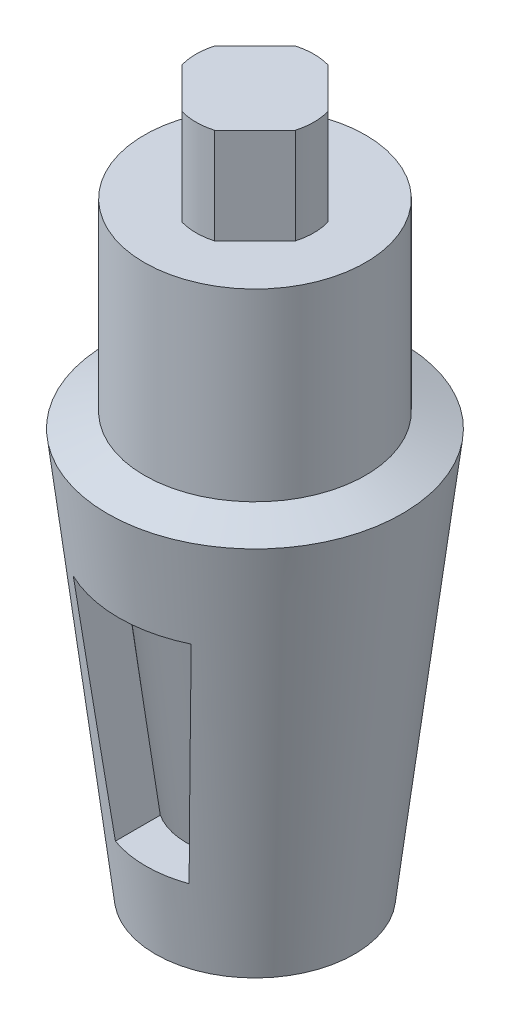
ISO-10303-21;
HEADER;
FILE_DESCRIPTION(('STEP AP214'),'2;1');
FILE_NAME('part.step','',(''),(''),'','','');
FILE_SCHEMA(('AUTOMOTIVE_DESIGN { 1 0 10303 214 1 1 1 1 }'));
ENDSEC;
DATA;
#1=APPLICATION_CONTEXT('core data for automotive mechanical design processes');
#2=APPLICATION_PROTOCOL_DEFINITION('international standard','automotive_design',2000,#1);
#3=PRODUCT_CONTEXT('',#1,'mechanical');
#4=PRODUCT('Part','Part','',(#3));
#5=PRODUCT_RELATED_PRODUCT_CATEGORY('part','',(#4));
#6=PRODUCT_DEFINITION_FORMATION('','',#4);
#7=PRODUCT_DEFINITION_CONTEXT('part definition',#1,'design');
#8=PRODUCT_DEFINITION('design','',#6,#7);
#9=PRODUCT_DEFINITION_SHAPE('','',#8);
#10=(LENGTH_UNIT() NAMED_UNIT(*) SI_UNIT(.MILLI.,.METRE.));
#11=(NAMED_UNIT(*) PLANE_ANGLE_UNIT() SI_UNIT($,.RADIAN.));
#12=(NAMED_UNIT(*) SI_UNIT($,.STERADIAN.) SOLID_ANGLE_UNIT());
#13=UNCERTAINTY_MEASURE_WITH_UNIT(LENGTH_MEASURE(1.E-05),#10,'distance_accuracy_value','');
#14=(GEOMETRIC_REPRESENTATION_CONTEXT(3) GLOBAL_UNCERTAINTY_ASSIGNED_CONTEXT((#13)) GLOBAL_UNIT_ASSIGNED_CONTEXT((#10,
#11,#12)) REPRESENTATION_CONTEXT('',''));
#15=CARTESIAN_POINT('',(0.,0.,0.));
#16=DIRECTION('',(0.,0.,1.));
#17=DIRECTION('',(1.,0.,0.));
#18=AXIS2_PLACEMENT_3D('',#15,#16,#17);
#19=CARTESIAN_POINT('',(0.,293.194202694159,0.));
#20=DIRECTION('',(0.,1.,0.));
#21=DIRECTION('',(0.,0.,1.));
#22=AXIS2_PLACEMENT_3D('',#19,#20,#21);
#23=CYLINDRICAL_SURFACE('',#22,16.);
#24=DIRECTION('',(0.,1.,0.));
#25=VECTOR('',#24,1.);
#26=CARTESIAN_POINT('',(-4.42226936156006,293.194202694159,-15.3767205116633));
#27=LINE('',#26,#25);
#28=CARTESIAN_POINT('',(-4.42226936156006,164.,-15.3767205116633));
#29=VERTEX_POINT('',#28);
#30=CARTESIAN_POINT('',(-4.42226936156006,190.,-15.3767205116633));
#31=VERTEX_POINT('',#30);
#32=EDGE_CURVE('E344',#29,#31,#27,.T.);
#33=ORIENTED_EDGE('',*,*,#32,.T.);
#34=CARTESIAN_POINT('',(0.,190.,0.));
#35=DIRECTION('',(0.,1.,0.));
#36=DIRECTION('',(0.,0.,1.));
#37=AXIS2_PLACEMENT_3D('',#34,#35,#36);
#38=CIRCLE('',#37,16.);
#39=CARTESIAN_POINT('',(4.42226936156005,190.,-15.3767205116633));
#40=VERTEX_POINT('',#39);
#41=EDGE_CURVE('E324',#40,#31,#38,.T.);
#42=ORIENTED_EDGE('',*,*,#41,.F.);
#43=DIRECTION('',(0.,1.,0.));
#44=VECTOR('',#43,1.);
#45=CARTESIAN_POINT('',(4.42226936156005,293.194202694159,-15.3767205116633));
#46=LINE('',#45,#44);
#47=CARTESIAN_POINT('',(4.42226936156005,164.,-15.3767205116633));
#48=VERTEX_POINT('',#47);
#49=EDGE_CURVE('E340',#40,#48,#46,.F.);
#50=ORIENTED_EDGE('',*,*,#49,.T.);
#51=CARTESIAN_POINT('',(0.,164.,0.));
#52=DIRECTION('',(0.,1.,0.));
#53=DIRECTION('',(0.,0.,1.));
#54=AXIS2_PLACEMENT_3D('',#51,#52,#53);
#55=CIRCLE('',#54,16.);
#56=EDGE_CURVE('E185',#48,#29,#55,.T.);
#57=ORIENTED_EDGE('',*,*,#56,.T.);
#58=EDGE_LOOP('',(#33,#42,#50,#57));
#59=FACE_BOUND('',#58,.T.);
#60=ADVANCED_FACE('F44',(#59),#23,.T.);
#61=DIRECTION('',(0.,1.,0.));
#62=VECTOR('',#61,1.);
#63=CARTESIAN_POINT('',(-15.3767205116633,293.194202694159,4.42226936156005));
#64=LINE('',#63,#62);
#65=CARTESIAN_POINT('',(-15.3767205116633,164.,4.42226936156005));
#66=VERTEX_POINT('',#65);
#67=CARTESIAN_POINT('',(-15.3767205116633,190.,4.42226936156005));
#68=VERTEX_POINT('',#67);
#69=EDGE_CURVE('E178',#66,#68,#64,.T.);
#70=ORIENTED_EDGE('',*,*,#69,.T.);
#71=CARTESIAN_POINT('',(-15.3767205116633,190.,-4.42226936156007));
#72=VERTEX_POINT('',#71);
#73=EDGE_CURVE('E321',#72,#68,#38,.T.);
#74=ORIENTED_EDGE('',*,*,#73,.F.);
#75=DIRECTION('',(0.,1.,0.));
#76=VECTOR('',#75,1.);
#77=CARTESIAN_POINT('',(-15.3767205116633,293.194202694159,-4.42226936156007));
#78=LINE('',#77,#76);
#79=CARTESIAN_POINT('',(-15.3767205116633,164.,-4.42226936156007));
#80=VERTEX_POINT('',#79);
#81=EDGE_CURVE('E67',#72,#80,#78,.F.);
#82=ORIENTED_EDGE('',*,*,#81,.T.);
#83=EDGE_CURVE('E188',#80,#66,#55,.T.);
#84=ORIENTED_EDGE('',*,*,#83,.T.);
#85=EDGE_LOOP('',(#70,#74,#82,#84));
#86=FACE_BOUND('',#85,.T.);
#87=ADVANCED_FACE('F329',(#86),#23,.T.);
#88=CARTESIAN_POINT('',(-4.42226936156005,190.,15.3767205116633));
#89=VERTEX_POINT('',#88);
#90=CARTESIAN_POINT('',(4.42226936156005,190.,15.3767205116633));
#91=VERTEX_POINT('',#90);
#92=EDGE_CURVE('E59',#89,#91,#38,.T.);
#93=ORIENTED_EDGE('',*,*,#92,.F.);
#94=DIRECTION('',(0.,1.,0.));
#95=VECTOR('',#94,1.);
#96=CARTESIAN_POINT('',(-4.42226936156004,293.194202694159,15.3767205116633));
#97=LINE('',#96,#95);
#98=CARTESIAN_POINT('',(-4.42226936156005,164.,15.3767205116633));
#99=VERTEX_POINT('',#98);
#100=EDGE_CURVE('E636',#89,#99,#97,.F.);
#101=ORIENTED_EDGE('',*,*,#100,.T.);
#102=CARTESIAN_POINT('',(4.42226936156005,164.,15.3767205116633));
#103=VERTEX_POINT('',#102);
#104=EDGE_CURVE('E184',#99,#103,#55,.T.);
#105=ORIENTED_EDGE('',*,*,#104,.T.);
#106=DIRECTION('',(0.,1.,0.));
#107=VECTOR('',#106,1.);
#108=CARTESIAN_POINT('',(4.42226936156005,293.194202694159,15.3767205116633));
#109=LINE('',#108,#107);
#110=EDGE_CURVE('E164',#103,#91,#109,.T.);
#111=ORIENTED_EDGE('',*,*,#110,.T.);
#112=EDGE_LOOP('',(#93,#101,#105,#111));
#113=FACE_BOUND('',#112,.T.);
#114=ADVANCED_FACE('F413',(#113),#23,.T.);
#115=CARTESIAN_POINT('',(15.3767205116633,190.,4.42226936156006));
#116=VERTEX_POINT('',#115);
#117=CARTESIAN_POINT('',(15.3767205116633,190.,-4.42226936156006));
#118=VERTEX_POINT('',#117);
#119=EDGE_CURVE('E177',#116,#118,#38,.T.);
#120=ORIENTED_EDGE('',*,*,#119,.F.);
#121=DIRECTION('',(0.,1.,0.));
#122=VECTOR('',#121,1.);
#123=CARTESIAN_POINT('',(15.3767205116633,293.194202694159,4.42226936156006));
#124=LINE('',#123,#122);
#125=CARTESIAN_POINT('',(15.3767205116633,164.,4.42226936156006));
#126=VERTEX_POINT('',#125);
#127=EDGE_CURVE('E162',#116,#126,#124,.F.);
#128=ORIENTED_EDGE('',*,*,#127,.T.);
#129=CARTESIAN_POINT('',(15.3767205116633,164.,-4.42226936156006));
#130=VERTEX_POINT('',#129);
#131=EDGE_CURVE('E175',#126,#130,#55,.T.);
#132=ORIENTED_EDGE('',*,*,#131,.T.);
#133=DIRECTION('',(0.,1.,0.));
#134=VECTOR('',#133,1.);
#135=CARTESIAN_POINT('',(15.3767205116633,293.194202694159,-4.42226936156006));
#136=LINE('',#135,#134);
#137=EDGE_CURVE('E338',#130,#118,#136,.T.);
#138=ORIENTED_EDGE('',*,*,#137,.T.);
#139=EDGE_LOOP('',(#120,#128,#132,#138));
#140=FACE_BOUND('',#139,.T.);
#141=ADVANCED_FACE('F173',(#140),#23,.T.);
#142=CARTESIAN_POINT('',(0.,190.,0.));
#143=DIRECTION('',(0.,1.,0.));
#144=DIRECTION('',(0.,0.,1.));
#145=AXIS2_PLACEMENT_3D('',#142,#143,#144);
#146=PLANE('',#145);
#147=ORIENTED_EDGE('',*,*,#119,.T.);
#148=DIRECTION('',(-0.707106781186548,0.,-0.707106781186547));
#149=VECTOR('',#148,1.);
#150=CARTESIAN_POINT('',(9.89949493661167,190.,-9.89949493661167));
#151=LINE('',#150,#149);
#152=EDGE_CURVE('E12',#118,#40,#151,.T.);
#153=ORIENTED_EDGE('',*,*,#152,.T.);
#154=ORIENTED_EDGE('',*,*,#41,.T.);
#155=DIRECTION('',(-0.707106781186548,0.,0.707106781186547));
#156=VECTOR('',#155,1.);
#157=CARTESIAN_POINT('',(-9.89949493661167,190.,-9.89949493661167));
#158=LINE('',#157,#156);
#159=EDGE_CURVE('E52',#31,#72,#158,.T.);
#160=ORIENTED_EDGE('',*,*,#159,.T.);
#161=ORIENTED_EDGE('',*,*,#73,.T.);
#162=DIRECTION('',(0.707106781186548,0.,0.707106781186547));
#163=VECTOR('',#162,1.);
#164=CARTESIAN_POINT('',(-9.89949493661166,190.,9.89949493661167));
#165=LINE('',#164,#163);
#166=EDGE_CURVE('E316',#68,#89,#165,.T.);
#167=ORIENTED_EDGE('',*,*,#166,.T.);
#168=ORIENTED_EDGE('',*,*,#92,.T.);
#169=DIRECTION('',(0.707106781186548,0.,-0.707106781186547));
#170=VECTOR('',#169,1.);
#171=CARTESIAN_POINT('',(9.89949493661167,190.,9.89949493661167));
#172=LINE('',#171,#170);
#173=EDGE_CURVE('E313',#91,#116,#172,.T.);
#174=ORIENTED_EDGE('',*,*,#173,.T.);
#175=EDGE_LOOP('',(#147,#153,#154,#160,#161,#167,#168,#174));
#176=FACE_BOUND('',#175,.T.);
#177=ADVANCED_FACE('F320',(#176),#146,.T.);
#178=CARTESIAN_POINT('',(0.,96.,0.));
#179=DIRECTION('',(0.,1.,0.));
#180=DIRECTION('',(0.,0.,1.));
#181=AXIS2_PLACEMENT_3D('',#178,#179,#180);
#182=TOROIDAL_SURFACE('',#181,22.3454545454546,5.);
#183=CARTESIAN_POINT('',(0.,101.,0.));
#184=DIRECTION('',(0.,1.,0.));
#185=DIRECTION('',(0.,0.,1.));
#186=AXIS2_PLACEMENT_3D('',#183,#184,#185);
#187=CIRCLE('',#186,22.3454545454546);
#188=CARTESIAN_POINT('',(0.,101.,22.3454545454546));
#189=VERTEX_POINT('',#188);
#190=EDGE_CURVE('E384',#189,#189,#187,.T.);
#191=ORIENTED_EDGE('',*,*,#190,.T.);
#192=EDGE_LOOP('',(#191));
#193=FACE_BOUND('',#192,.T.);
#194=CARTESIAN_POINT('',(0.,96.,0.));
#195=DIRECTION('',(0.,1.,0.));
#196=DIRECTION('',(0.,0.,1.));
#197=AXIS2_PLACEMENT_3D('',#194,#195,#196);
#198=CIRCLE('',#197,27.3454545454546);
#199=CARTESIAN_POINT('',(0.,96.,27.3454545454546));
#200=VERTEX_POINT('',#199);
#201=EDGE_CURVE('E206',#200,#200,#198,.T.);
#202=ORIENTED_EDGE('',*,*,#201,.F.);
#203=EDGE_LOOP('',(#202));
#204=FACE_BOUND('',#203,.T.);
#205=ADVANCED_FACE('F46',(#193,#204),#182,.F.);
#206=CARTESIAN_POINT('',(0.,0.,0.));
#207=DIRECTION('',(0.,1.,0.));
#208=DIRECTION('',(0.,0.,1.));
#209=AXIS2_PLACEMENT_3D('',#206,#207,#208);
#210=CONICAL_SURFACE('',#209,16.,0.117636170678296);
#211=CARTESIAN_POINT('',(9.99998064516133,21.9998,-15.6830962448182));
#212=CARTESIAN_POINT('',(10.2664100436928,24.7529037848253,-15.8990888567475));
#213=CARTESIAN_POINT('',(10.5328477470877,27.5060933865721,-16.1139743369987));
#214=CARTESIAN_POINT('',(11.0657379320921,33.0126252982844,-16.5417574333598));
#215=CARTESIAN_POINT('',(11.3321904137,35.7659676082326,-16.7546550496969));
#216=CARTESIAN_POINT('',(12.1315667892713,44.0261901558032,-17.3907053132004));
#217=CARTESIAN_POINT('',(12.6645101945005,49.5332720098386,-17.8112158444886));
#218=CARTESIAN_POINT('',(13.664536569891,59.8668778888734,-18.5949186775926));
#219=CARTESIAN_POINT('',(14.1316147636719,64.6933525579424,-18.9587690038549));
#220=CARTESIAN_POINT('',(15.0657981678184,74.346581067456,-19.6827752494505));
#221=CARTESIAN_POINT('',(15.532903378209,79.1733349081594,-20.0429311653031));
#222=CARTESIAN_POINT('',(16.0000193548387,84.0002,-20.4015704633888));
#223=B_SPLINE_CURVE_WITH_KNOTS('',3,(#211,#212,#213,#214,#215,#216,#217,#218,#219,#220,#221,
#222),.UNSPECIFIED.,.F.,.F.,(4,2,2,2,2,4),(0.,8.32315751629867,16.6463140822135,
33.2926090791148,47.8805706190013,62.4685459014698),.UNSPECIFIED.);
#224=CARTESIAN_POINT('',(10.,22.,-15.6831119360922));
#225=VERTEX_POINT('',#224);
#226=CARTESIAN_POINT('',(16.,84.,-20.4015556042763));
#227=VERTEX_POINT('',#226);
#228=EDGE_CURVE('E276',#225,#227,#223,.T.);
#229=ORIENTED_EDGE('',*,*,#228,.F.);
#230=CARTESIAN_POINT('',(0.,22.,0.));
#231=DIRECTION('',(0.,-1.,0.));
#232=DIRECTION('',(0.,0.,-1.));
#233=AXIS2_PLACEMENT_3D('',#230,#231,#232);
#234=CIRCLE('',#233,18.6);
#235=CARTESIAN_POINT('',(-10.,22.,-15.6831119360923));
#236=VERTEX_POINT('',#235);
#237=EDGE_CURVE('E284',#236,#225,#234,.T.);
#238=ORIENTED_EDGE('',*,*,#237,.F.);
#239=CARTESIAN_POINT('',(-16.0000193548387,84.0002,-20.4015704633888));
#240=CARTESIAN_POINT('',(-15.6285160246268,80.1613322544766,-20.116349812216));
#241=CARTESIAN_POINT('',(-15.2570195889898,76.3225357528947,-19.8301585828326));
#242=CARTESIAN_POINT('',(-14.5140428082242,68.6451090183161,-19.2555205663034));
#243=CARTESIAN_POINT('',(-14.1425624630997,64.8064787853636,-18.9670737785621));
#244=CARTESIAN_POINT('',(-13.3996210244813,57.1294172529736,-18.3876109118262));
#245=CARTESIAN_POINT('',(-13.0281599309542,53.290985953193,-18.0965948374224));
#246=CARTESIAN_POINT('',(-12.2852594658392,45.6143478136718,-17.51159393263));
#247=CARTESIAN_POINT('',(-11.9138200942488,41.776140973904,-17.2176091026006));
#248=CARTESIAN_POINT('',(-11.2853114476469,35.2815516256841,-16.717220490022));
#249=CARTESIAN_POINT('',(-11.0282355263528,32.6251004389786,-16.5117165269181));
#250=CARTESIAN_POINT('',(-10.5140973741545,27.3123395329297,-16.0988505862438));
#251=CARTESIAN_POINT('',(-10.2570351432586,24.6560298136723,-15.8914886075562));
#252=CARTESIAN_POINT('',(-9.99998064516133,21.9998,-15.6830962448182));
#253=B_SPLINE_CURVE_WITH_KNOTS('',3,(#239,#240,#241,#242,#243,#244,#245,#246,#247,#248,#249,
#250,#251,#252),.UNSPECIFIED.,.F.,.F.,(4,2,2,2,2,2,4),(0.,11.6020017282075,23.2040065194539,
34.8059905847314,46.4079732467133,54.4382575329063,62.4685466474967),.UNSPECIFIED.);
#254=CARTESIAN_POINT('',(-16.,84.,-20.4015556042763));
#255=VERTEX_POINT('',#254);
#256=EDGE_CURVE('E257',#255,#236,#253,.T.);
#257=ORIENTED_EDGE('',*,*,#256,.F.);
#258=CARTESIAN_POINT('',(0.,84.,0.));
#259=DIRECTION('',(0.,1.,0.));
#260=DIRECTION('',(0.,0.,1.));
#261=AXIS2_PLACEMENT_3D('',#258,#259,#260);
#262=CIRCLE('',#261,25.9272727272727);
#263=EDGE_CURVE('E258',#227,#255,#262,.T.);
#264=ORIENTED_EDGE('',*,*,#263,.F.);
#265=EDGE_LOOP('',(#229,#238,#257,#264));
#266=FACE_BOUND('',#265,.T.);
#267=CARTESIAN_POINT('',(16.0000193548387,84.0002,20.4015704633888));
#268=CARTESIAN_POINT('',(15.6285160246268,80.1613322544766,20.116349812216));
#269=CARTESIAN_POINT('',(15.2570195889898,76.3225357528947,19.8301585828326));
#270=CARTESIAN_POINT('',(14.5140428082242,68.6451090183161,19.2555205663034));
#271=CARTESIAN_POINT('',(14.1425624630997,64.8064787853636,18.9670737785621));
#272=CARTESIAN_POINT('',(13.3996210244813,57.1294172529736,18.3876109118262));
#273=CARTESIAN_POINT('',(13.0281599309542,53.290985953193,18.0965948374224));
#274=CARTESIAN_POINT('',(12.2852594658392,45.6143478136718,17.51159393263));
#275=CARTESIAN_POINT('',(11.9138200942488,41.776140973904,17.2176091026006));
#276=CARTESIAN_POINT('',(11.2853114476469,35.2815516256841,16.717220490022));
#277=CARTESIAN_POINT('',(11.0282355263528,32.6251004389786,16.5117165269181));
#278=CARTESIAN_POINT('',(10.5140973741545,27.3123395329297,16.0988505862438));
#279=CARTESIAN_POINT('',(10.2570351432586,24.6560298136723,15.8914886075562));
#280=CARTESIAN_POINT('',(9.99998064516133,21.9998,15.6830962448182));
#281=B_SPLINE_CURVE_WITH_KNOTS('',3,(#267,#268,#269,#270,#271,#272,#273,#274,#275,#276,#277,
#278,#279,#280),.UNSPECIFIED.,.F.,.F.,(4,2,2,2,2,2,4),(0.,11.6020017282075,23.2040065194539,
34.8059905847314,46.4079732467133,54.4382575329063,62.4685466474967),.UNSPECIFIED.);
#282=CARTESIAN_POINT('',(16.,84.,20.4015556042763));
#283=VERTEX_POINT('',#282);
#284=CARTESIAN_POINT('',(10.,22.,15.6831119360922));
#285=VERTEX_POINT('',#284);
#286=EDGE_CURVE('E282',#283,#285,#281,.T.);
#287=ORIENTED_EDGE('',*,*,#286,.F.);
#288=CARTESIAN_POINT('',(-16.,84.,20.4015556042763));
#289=VERTEX_POINT('',#288);
#290=EDGE_CURVE('E259',#289,#283,#262,.T.);
#291=ORIENTED_EDGE('',*,*,#290,.F.);
#292=CARTESIAN_POINT('',(-9.99998064516133,21.9998,15.6830962448182));
#293=CARTESIAN_POINT('',(-10.2664100436928,24.7529037848253,15.8990888567475));
#294=CARTESIAN_POINT('',(-10.5328477470877,27.5060933865721,16.1139743369987));
#295=CARTESIAN_POINT('',(-11.0657379320921,33.0126252982844,16.5417574333598));
#296=CARTESIAN_POINT('',(-11.3321904137,35.7659676082326,16.7546550496969));
#297=CARTESIAN_POINT('',(-12.1315667892713,44.0261901558032,17.3907053132004));
#298=CARTESIAN_POINT('',(-12.6645101945005,49.5332720098386,17.8112158444886));
#299=CARTESIAN_POINT('',(-13.664536569891,59.8668778888734,18.5949186775926));
#300=CARTESIAN_POINT('',(-14.1316147636719,64.6933525579424,18.9587690038549));
#301=CARTESIAN_POINT('',(-15.0657981678184,74.346581067456,19.6827752494505));
#302=CARTESIAN_POINT('',(-15.532903378209,79.1733349081594,20.0429311653031));
#303=CARTESIAN_POINT('',(-16.0000193548387,84.0002,20.4015704633888));
#304=B_SPLINE_CURVE_WITH_KNOTS('',3,(#292,#293,#294,#295,#296,#297,#298,#299,#300,#301,#302,
#303),.UNSPECIFIED.,.F.,.F.,(4,2,2,2,2,4),(0.,8.32315751629867,16.6463140822135,
33.2926090791148,47.8805706190013,62.4685459014698),.UNSPECIFIED.);
#305=CARTESIAN_POINT('',(-10.,22.,15.6831119360923));
#306=VERTEX_POINT('',#305);
#307=EDGE_CURVE('E250',#306,#289,#304,.T.);
#308=ORIENTED_EDGE('',*,*,#307,.F.);
#309=EDGE_CURVE('E283',#285,#306,#234,.T.);
#310=ORIENTED_EDGE('',*,*,#309,.F.);
#311=EDGE_LOOP('',(#287,#291,#308,#310));
#312=FACE_BOUND('',#311,.T.);
#313=ORIENTED_EDGE('',*,*,#201,.T.);
#314=EDGE_LOOP('',(#313));
#315=FACE_BOUND('',#314,.T.);
#316=CARTESIAN_POINT('',(0.,0.,0.));
#317=DIRECTION('',(0.,1.,0.));
#318=DIRECTION('',(0.,0.,1.));
#319=AXIS2_PLACEMENT_3D('',#316,#317,#318);
#320=CIRCLE('',#319,16.);
#321=CARTESIAN_POINT('',(0.,0.,16.));
#322=VERTEX_POINT('',#321);
#323=EDGE_CURVE('E203',#322,#322,#320,.T.);
#324=ORIENTED_EDGE('',*,*,#323,.F.);
#325=EDGE_LOOP('',(#324));
#326=FACE_BOUND('',#325,.T.);
#327=ADVANCED_FACE('F266',(#266,#312,#315,#326),#210,.F.);
#328=CARTESIAN_POINT('',(0.,0.,0.));
#329=DIRECTION('',(0.,-1.,0.));
#330=DIRECTION('',(0.,0.,-1.));
#331=AXIS2_PLACEMENT_3D('',#328,#329,#330);
#332=PLANE('',#331);
#333=ORIENTED_EDGE('',*,*,#323,.T.);
#334=EDGE_LOOP('',(#333));
#335=FACE_BOUND('',#334,.T.);
#336=CARTESIAN_POINT('',(0.,0.,0.));
#337=DIRECTION('',(0.,1.,0.));
#338=DIRECTION('',(0.,0.,1.));
#339=AXIS2_PLACEMENT_3D('',#336,#337,#338);
#340=CIRCLE('',#339,27.);
#341=CARTESIAN_POINT('',(0.,0.,27.));
#342=VERTEX_POINT('',#341);
#343=EDGE_CURVE('E200',#342,#342,#340,.T.);
#344=ORIENTED_EDGE('',*,*,#343,.F.);
#345=EDGE_LOOP('',(#344));
#346=FACE_BOUND('',#345,.T.);
#347=ADVANCED_FACE('F269',(#335,#346),#332,.T.);
#348=CARTESIAN_POINT('',(0.,110.,0.));
#349=DIRECTION('',(0.,1.,0.));
#350=DIRECTION('',(0.,0.,1.));
#351=AXIS2_PLACEMENT_3D('',#348,#349,#350);
#352=CONICAL_SURFACE('',#351,40.,0.117636170678296);
#353=CARTESIAN_POINT('',(16.0000193548387,84.0002,-33.2809945370119));
#354=CARTESIAN_POINT('',(15.4998952389197,78.8322508021704,-32.8437344748617));
#355=CARTESIAN_POINT('',(14.9997954084154,73.6645525536255,-32.4034672511638));
#356=CARTESIAN_POINT('',(13.9996538254735,63.329756196559,-31.5160230664465));
#357=CARTESIAN_POINT('',(13.4996120729035,58.1626580866691,-31.0688461215048));
#358=CARTESIAN_POINT('',(12.4995934932972,47.8291327640707,-30.1666847537774));
#359=CARTESIAN_POINT('',(11.9996166663043,42.6627055518109,-29.7117003257977));
#360=CARTESIAN_POINT('',(10.9997386999176,32.3306332324815,-28.7927221853013));
#361=CARTESIAN_POINT('',(10.4998375607029,27.1649881272626,-28.3287284517931));
#362=CARTESIAN_POINT('',(9.99998064516132,21.9998,-27.8596300733558));
#363=B_SPLINE_CURVE_WITH_KNOTS('',3,(#353,#354,#355,#356,#357,#358,#359,#360,#361,#362),
.UNSPECIFIED.,.F.,.F.,(4,2,2,2,4),(0.,15.6314169975852,31.2627976290784,46.8941886596563,
62.5256161154015),.UNSPECIFIED.);
#364=CARTESIAN_POINT('',(16.,84.,-33.2809776159653));
#365=VERTEX_POINT('',#364);
#366=CARTESIAN_POINT('',(10.,22.,-27.8596482389853));
#367=VERTEX_POINT('',#366);
#368=EDGE_CURVE('E307',#365,#367,#363,.T.);
#369=ORIENTED_EDGE('',*,*,#368,.F.);
#370=CARTESIAN_POINT('',(0.,84.,0.));
#371=DIRECTION('',(0.,1.,0.));
#372=DIRECTION('',(0.,0.,1.));
#373=AXIS2_PLACEMENT_3D('',#370,#371,#372);
#374=CIRCLE('',#373,36.9272727272727);
#375=CARTESIAN_POINT('',(-16.,84.,-33.2809776159653));
#376=VERTEX_POINT('',#375);
#377=EDGE_CURVE('E212',#376,#365,#374,.F.);
#378=ORIENTED_EDGE('',*,*,#377,.F.);
#379=CARTESIAN_POINT('',(-9.99998064516133,21.9998,-27.8596300733558));
#380=CARTESIAN_POINT('',(-10.4235420500607,26.3766011839602,-28.2571410386468));
#381=CARTESIAN_POINT('',(-10.8471353826154,30.753732287025,-28.6509712234843));
#382=CARTESIAN_POINT('',(-11.6943784005329,39.5085768055062,-29.4320263667531));
#383=CARTESIAN_POINT('',(-12.1180280858741,43.8862902206988,-29.8192513277134));
#384=CARTESIAN_POINT('',(-12.965375175556,52.6422101474117,-30.5878513405848));
#385=CARTESIAN_POINT('',(-13.3890725797277,57.020416657186,-30.9692264125905));
#386=CARTESIAN_POINT('',(-14.2365108533215,65.7772788176554,-31.7267353322961));
#387=CARTESIAN_POINT('',(-14.6602517227438,70.1559344683528,-32.1028691799676));
#388=CARTESIAN_POINT('',(-15.2366748508251,76.1123067918595,-32.6113012690305));
#389=CARTESIAN_POINT('',(-15.3893403444976,77.6898502264753,-32.7456511624705));
#390=CARTESIAN_POINT('',(-15.6946762398784,80.8449878120768,-33.01376042383));
#391=CARTESIAN_POINT('',(-15.8473466415897,82.4225819630938,-33.1475197913775));
#392=CARTESIAN_POINT('',(-16.0000193548387,84.0002,-33.2809945370119));
#393=B_SPLINE_CURVE_WITH_KNOTS('',3,(#379,#380,#381,#382,#383,#384,#385,#386,#387,#388,#389,
#390,#391,#392),.UNSPECIFIED.,.F.,.F.,(4,2,2,2,2,2,4),(0.,13.2455343627759,26.4910636539955,
39.7365474358904,52.9820312893014,57.7538232697875,62.5256182549216),.UNSPECIFIED.);
#394=CARTESIAN_POINT('',(-10.,22.,-27.8596482389853));
#395=VERTEX_POINT('',#394);
#396=EDGE_CURVE('E243',#395,#376,#393,.T.);
#397=ORIENTED_EDGE('',*,*,#396,.F.);
#398=CARTESIAN_POINT('',(0.,22.,0.));
#399=DIRECTION('',(0.,-1.,0.));
#400=DIRECTION('',(0.,0.,-1.));
#401=AXIS2_PLACEMENT_3D('',#398,#399,#400);
#402=CIRCLE('',#401,29.6);
#403=EDGE_CURVE('E314',#367,#395,#402,.F.);
#404=ORIENTED_EDGE('',*,*,#403,.F.);
#405=EDGE_LOOP('',(#369,#378,#397,#404));
#406=FACE_BOUND('',#405,.T.);
#407=CARTESIAN_POINT('',(9.99998064516133,21.9998,27.8596300733558));
#408=CARTESIAN_POINT('',(10.4235420500607,26.3766011839602,28.2571410386468));
#409=CARTESIAN_POINT('',(10.8471353826154,30.753732287025,28.6509712234843));
#410=CARTESIAN_POINT('',(11.6943784005329,39.5085768055062,29.4320263667531));
#411=CARTESIAN_POINT('',(12.1180280858741,43.8862902206988,29.8192513277134));
#412=CARTESIAN_POINT('',(12.965375175556,52.6422101474117,30.5878513405848));
#413=CARTESIAN_POINT('',(13.3890725797277,57.020416657186,30.9692264125905));
#414=CARTESIAN_POINT('',(14.2365108533215,65.7772788176554,31.7267353322961));
#415=CARTESIAN_POINT('',(14.6602517227438,70.1559344683528,32.1028691799676));
#416=CARTESIAN_POINT('',(15.2366748508251,76.1123067918595,32.6113012690305));
#417=CARTESIAN_POINT('',(15.3893403444976,77.6898502264753,32.7456511624705));
#418=CARTESIAN_POINT('',(15.6946762398784,80.8449878120768,33.01376042383));
#419=CARTESIAN_POINT('',(15.8473466415897,82.4225819630938,33.1475197913775));
#420=CARTESIAN_POINT('',(16.0000193548387,84.0002,33.2809945370119));
#421=B_SPLINE_CURVE_WITH_KNOTS('',3,(#407,#408,#409,#410,#411,#412,#413,#414,#415,#416,#417,
#418,#419,#420),.UNSPECIFIED.,.F.,.F.,(4,2,2,2,2,2,4),(0.,13.2455343627759,26.4910636539955,
39.7365474358904,52.9820312893014,57.7538232697875,62.5256182549216),.UNSPECIFIED.);
#422=CARTESIAN_POINT('',(10.,22.,27.8596482389853));
#423=VERTEX_POINT('',#422);
#424=CARTESIAN_POINT('',(16.,84.,33.2809776159653));
#425=VERTEX_POINT('',#424);
#426=EDGE_CURVE('E301',#423,#425,#421,.T.);
#427=ORIENTED_EDGE('',*,*,#426,.F.);
#428=CARTESIAN_POINT('',(-10.,22.,27.8596482389853));
#429=VERTEX_POINT('',#428);
#430=EDGE_CURVE('E220',#429,#423,#402,.F.);
#431=ORIENTED_EDGE('',*,*,#430,.F.);
#432=CARTESIAN_POINT('',(-16.0000193548387,84.0002,33.2809945370119));
#433=CARTESIAN_POINT('',(-15.4998952389197,78.8322508021704,32.8437344748617));
#434=CARTESIAN_POINT('',(-14.9997954084154,73.6645525536255,32.4034672511638));
#435=CARTESIAN_POINT('',(-13.9996538254735,63.329756196559,31.5160230664465));
#436=CARTESIAN_POINT('',(-13.4996120729035,58.1626580866691,31.0688461215048));
#437=CARTESIAN_POINT('',(-12.4995934932972,47.8291327640707,30.1666847537774));
#438=CARTESIAN_POINT('',(-11.9996166663043,42.6627055518109,29.7117003257977));
#439=CARTESIAN_POINT('',(-10.9997386999176,32.3306332324815,28.7927221853013));
#440=CARTESIAN_POINT('',(-10.4998375607029,27.1649881272626,28.3287284517931));
#441=CARTESIAN_POINT('',(-9.99998064516132,21.9998,27.8596300733558));
#442=B_SPLINE_CURVE_WITH_KNOTS('',3,(#432,#433,#434,#435,#436,#437,#438,#439,#440,#441),
.UNSPECIFIED.,.F.,.F.,(4,2,2,2,4),(0.,15.6314169975852,31.2627976290784,46.8941886596563,
62.5256161154015),.UNSPECIFIED.);
#443=CARTESIAN_POINT('',(-16.,84.,33.2809776159653));
#444=VERTEX_POINT('',#443);
#445=EDGE_CURVE('E211',#444,#429,#442,.T.);
#446=ORIENTED_EDGE('',*,*,#445,.F.);
#447=EDGE_CURVE('E209',#425,#444,#374,.F.);
#448=ORIENTED_EDGE('',*,*,#447,.F.);
#449=EDGE_LOOP('',(#427,#431,#446,#448));
#450=FACE_BOUND('',#449,.T.);
#451=ORIENTED_EDGE('',*,*,#343,.T.);
#452=EDGE_LOOP('',(#451));
#453=FACE_BOUND('',#452,.T.);
#454=CARTESIAN_POINT('',(0.,110.,0.));
#455=DIRECTION('',(0.,1.,0.));
#456=DIRECTION('',(0.,0.,1.));
#457=AXIS2_PLACEMENT_3D('',#454,#455,#456);
#458=CIRCLE('',#457,40.);
#459=CARTESIAN_POINT('',(0.,110.,40.));
#460=VERTEX_POINT('',#459);
#461=EDGE_CURVE('E197',#460,#460,#458,.T.);
#462=ORIENTED_EDGE('',*,*,#461,.F.);
#463=EDGE_LOOP('',(#462));
#464=FACE_BOUND('',#463,.T.);
#465=ADVANCED_FACE('F222',(#406,#450,#453,#464),#352,.T.);
#466=CARTESIAN_POINT('',(0.,114.,0.));
#467=DIRECTION('',(0.,-1.,0.));
#468=DIRECTION('',(0.,0.,-1.));
#469=AXIS2_PLACEMENT_3D('',#466,#467,#468);
#470=CONICAL_SURFACE('',#469,30.,1.19028994968253);
#471=ORIENTED_EDGE('',*,*,#461,.T.);
#472=EDGE_LOOP('',(#471));
#473=FACE_BOUND('',#472,.T.);
#474=CARTESIAN_POINT('',(0.,114.,0.));
#475=DIRECTION('',(0.,1.,0.));
#476=DIRECTION('',(0.,0.,1.));
#477=AXIS2_PLACEMENT_3D('',#474,#475,#476);
#478=CIRCLE('',#477,30.);
#479=CARTESIAN_POINT('',(0.,114.,30.));
#480=VERTEX_POINT('',#479);
#481=EDGE_CURVE('E194',#480,#480,#478,.T.);
#482=ORIENTED_EDGE('',*,*,#481,.F.);
#483=EDGE_LOOP('',(#482));
#484=FACE_BOUND('',#483,.T.);
#485=ADVANCED_FACE('F510',(#473,#484),#470,.T.);
#486=CARTESIAN_POINT('',(0.,293.194202694159,0.));
#487=DIRECTION('',(0.,1.,0.));
#488=DIRECTION('',(0.,0.,1.));
#489=AXIS2_PLACEMENT_3D('',#486,#487,#488);
#490=CYLINDRICAL_SURFACE('',#489,30.);
#491=ORIENTED_EDGE('',*,*,#481,.T.);
#492=EDGE_LOOP('',(#491));
#493=FACE_BOUND('',#492,.T.);
#494=CARTESIAN_POINT('',(0.,164.,0.));
#495=DIRECTION('',(0.,1.,0.));
#496=DIRECTION('',(0.,0.,1.));
#497=AXIS2_PLACEMENT_3D('',#494,#495,#496);
#498=CIRCLE('',#497,30.);
#499=CARTESIAN_POINT('',(0.,164.,30.));
#500=VERTEX_POINT('',#499);
#501=EDGE_CURVE('E187',#500,#500,#498,.T.);
#502=ORIENTED_EDGE('',*,*,#501,.F.);
#503=EDGE_LOOP('',(#502));
#504=FACE_BOUND('',#503,.T.);
#505=ADVANCED_FACE('F404',(#493,#504),#490,.T.);
#506=CARTESIAN_POINT('',(0.,164.,0.));
#507=DIRECTION('',(0.,1.,0.));
#508=DIRECTION('',(0.,0.,1.));
#509=AXIS2_PLACEMENT_3D('',#506,#507,#508);
#510=PLANE('',#509);
#511=DIRECTION('',(0.707106781186548,0.,0.707106781186547));
#512=VECTOR('',#511,1.);
#513=CARTESIAN_POINT('',(3.79898987322333,164.,-16.));
#514=LINE('',#513,#512);
#515=EDGE_CURVE('E169',#48,#130,#514,.T.);
#516=ORIENTED_EDGE('',*,*,#515,.T.);
#517=ORIENTED_EDGE('',*,*,#131,.F.);
#518=DIRECTION('',(-0.707106781186548,0.,0.707106781186547));
#519=VECTOR('',#518,1.);
#520=CARTESIAN_POINT('',(16.,164.,3.79898987322333));
#521=LINE('',#520,#519);
#522=EDGE_CURVE('E159',#126,#103,#521,.T.);
#523=ORIENTED_EDGE('',*,*,#522,.T.);
#524=ORIENTED_EDGE('',*,*,#104,.F.);
#525=DIRECTION('',(-0.707106781186548,0.,-0.707106781186547));
#526=VECTOR('',#525,1.);
#527=CARTESIAN_POINT('',(-3.79898987322332,164.,16.));
#528=LINE('',#527,#526);
#529=EDGE_CURVE('E168',#99,#66,#528,.T.);
#530=ORIENTED_EDGE('',*,*,#529,.T.);
#531=ORIENTED_EDGE('',*,*,#83,.F.);
#532=DIRECTION('',(0.707106781186548,0.,-0.707106781186547));
#533=VECTOR('',#532,1.);
#534=CARTESIAN_POINT('',(-16.,164.,-3.79898987322334));
#535=LINE('',#534,#533);
#536=EDGE_CURVE('E641',#80,#29,#535,.T.);
#537=ORIENTED_EDGE('',*,*,#536,.T.);
#538=ORIENTED_EDGE('',*,*,#56,.F.);
#539=EDGE_LOOP('',(#516,#517,#523,#524,#530,#531,#537,#538));
#540=FACE_BOUND('',#539,.T.);
#541=ORIENTED_EDGE('',*,*,#501,.T.);
#542=EDGE_LOOP('',(#541));
#543=FACE_BOUND('',#542,.T.);
#544=ADVANCED_FACE('F181',(#540,#543),#510,.T.);
#545=CARTESIAN_POINT('',(0.,157.,0.));
#546=DIRECTION('',(0.,1.,0.));
#547=DIRECTION('',(0.,0.,1.));
#548=AXIS2_PLACEMENT_3D('',#545,#546,#547);
#549=PLANE('',#548);
#550=CARTESIAN_POINT('',(0.,157.,0.));
#551=DIRECTION('',(0.,1.,0.));
#552=DIRECTION('',(0.,0.,1.));
#553=AXIS2_PLACEMENT_3D('',#550,#551,#552);
#554=CIRCLE('',#553,20.);
#555=CARTESIAN_POINT('',(0.,157.,20.));
#556=VERTEX_POINT('',#555);
#557=EDGE_CURVE('E332',#556,#556,#554,.T.);
#558=ORIENTED_EDGE('',*,*,#557,.F.);
#559=EDGE_LOOP('',(#558));
#560=FACE_BOUND('',#559,.T.);
#561=ADVANCED_FACE('F396',(#560),#549,.F.);
#562=CARTESIAN_POINT('',(0.,293.194202694159,0.));
#563=DIRECTION('',(0.,1.,0.));
#564=DIRECTION('',(0.,0.,1.));
#565=AXIS2_PLACEMENT_3D('',#562,#563,#564);
#566=CYLINDRICAL_SURFACE('',#565,20.0000000000001);
#567=CARTESIAN_POINT('',(0.,101.,0.));
#568=DIRECTION('',(0.,1.,0.));
#569=DIRECTION('',(0.,0.,1.));
#570=AXIS2_PLACEMENT_3D('',#567,#568,#569);
#571=CIRCLE('',#570,20.0000000000002);
#572=CARTESIAN_POINT('',(0.,101.,20.0000000000002));
#573=VERTEX_POINT('',#572);
#574=EDGE_CURVE('E334',#573,#573,#571,.T.);
#575=ORIENTED_EDGE('',*,*,#574,.F.);
#576=EDGE_LOOP('',(#575));
#577=FACE_BOUND('',#576,.T.);
#578=ORIENTED_EDGE('',*,*,#557,.T.);
#579=EDGE_LOOP('',(#578));
#580=FACE_BOUND('',#579,.T.);
#581=ADVANCED_FACE('F393',(#577,#580),#566,.F.);
#582=CARTESIAN_POINT('',(0.,101.,0.));
#583=DIRECTION('',(0.,1.,0.));
#584=DIRECTION('',(0.,0.,1.));
#585=AXIS2_PLACEMENT_3D('',#582,#583,#584);
#586=PLANE('',#585);
#587=ORIENTED_EDGE('',*,*,#190,.F.);
#588=EDGE_LOOP('',(#587));
#589=FACE_BOUND('',#588,.T.);
#590=ORIENTED_EDGE('',*,*,#574,.T.);
#591=EDGE_LOOP('',(#590));
#592=FACE_BOUND('',#591,.T.);
#593=ADVANCED_FACE('F297',(#589,#592),#586,.F.);
#594=CARTESIAN_POINT('',(16.,84.,-40.));
#595=DIRECTION('',(0.,1.,0.));
#596=DIRECTION('',(0.,0.,1.));
#597=AXIS2_PLACEMENT_3D('',#594,#595,#596);
#598=PLANE('',#597);
#599=ORIENTED_EDGE('',*,*,#290,.T.);
#600=DIRECTION('',(0.,0.,1.));
#601=VECTOR('',#600,1.);
#602=CARTESIAN_POINT('',(16.,84.,-40.));
#603=LINE('',#602,#601);
#604=EDGE_CURVE('E342',#283,#425,#603,.T.);
#605=ORIENTED_EDGE('',*,*,#604,.T.);
#606=ORIENTED_EDGE('',*,*,#447,.T.);
#607=DIRECTION('',(0.,0.,1.));
#608=VECTOR('',#607,1.);
#609=CARTESIAN_POINT('',(-16.,84.,-40.));
#610=LINE('',#609,#608);
#611=EDGE_CURVE('E357',#289,#444,#610,.T.);
#612=ORIENTED_EDGE('',*,*,#611,.F.);
#613=EDGE_LOOP('',(#599,#605,#606,#612));
#614=FACE_BOUND('',#613,.T.);
#615=ADVANCED_FACE('F232',(#614),#598,.F.);
#616=CARTESIAN_POINT('',(-16.,84.,-40.));
#617=DIRECTION('',(-0.9953500135553,-0.0963241948601902,0.));
#618=DIRECTION('',(0.0963241948601902,-0.9953500135553,0.));
#619=AXIS2_PLACEMENT_3D('',#616,#617,#618);
#620=PLANE('',#619);
#621=ORIENTED_EDGE('',*,*,#307,.T.);
#622=ORIENTED_EDGE('',*,*,#611,.T.);
#623=ORIENTED_EDGE('',*,*,#445,.T.);
#624=DIRECTION('',(0.,0.,1.));
#625=VECTOR('',#624,1.);
#626=CARTESIAN_POINT('',(-10.,22.,-40.));
#627=LINE('',#626,#625);
#628=EDGE_CURVE('E353',#306,#429,#627,.T.);
#629=ORIENTED_EDGE('',*,*,#628,.F.);
#630=EDGE_LOOP('',(#621,#622,#623,#629));
#631=FACE_BOUND('',#630,.T.);
#632=ADVANCED_FACE('F226',(#631),#620,.F.);
#633=CARTESIAN_POINT('',(10.,22.,-40.));
#634=DIRECTION('',(0.,-1.,0.));
#635=DIRECTION('',(0.,0.,-1.));
#636=AXIS2_PLACEMENT_3D('',#633,#634,#635);
#637=PLANE('',#636);
#638=ORIENTED_EDGE('',*,*,#309,.T.);
#639=ORIENTED_EDGE('',*,*,#628,.T.);
#640=ORIENTED_EDGE('',*,*,#430,.T.);
#641=DIRECTION('',(0.,0.,1.));
#642=VECTOR('',#641,1.);
#643=CARTESIAN_POINT('',(10.,22.,-40.));
#644=LINE('',#643,#642);
#645=EDGE_CURVE('E348',#285,#423,#644,.T.);
#646=ORIENTED_EDGE('',*,*,#645,.F.);
#647=EDGE_LOOP('',(#638,#639,#640,#646));
#648=FACE_BOUND('',#647,.T.);
#649=ADVANCED_FACE('F231',(#648),#637,.F.);
#650=CARTESIAN_POINT('',(16.,84.,-40.));
#651=DIRECTION('',(0.9953500135553,-0.0963241948601902,0.));
#652=DIRECTION('',(0.0963241948601902,0.9953500135553,0.));
#653=AXIS2_PLACEMENT_3D('',#650,#651,#652);
#654=PLANE('',#653);
#655=ORIENTED_EDGE('',*,*,#286,.T.);
#656=ORIENTED_EDGE('',*,*,#645,.T.);
#657=ORIENTED_EDGE('',*,*,#426,.T.);
#658=ORIENTED_EDGE('',*,*,#604,.F.);
#659=EDGE_LOOP('',(#655,#656,#657,#658));
#660=FACE_BOUND('',#659,.T.);
#661=ADVANCED_FACE('F296',(#660),#654,.F.);
#662=ORIENTED_EDGE('',*,*,#256,.T.);
#663=EDGE_CURVE('E352',#395,#236,#627,.T.);
#664=ORIENTED_EDGE('',*,*,#663,.F.);
#665=ORIENTED_EDGE('',*,*,#396,.T.);
#666=EDGE_CURVE('E356',#376,#255,#610,.T.);
#667=ORIENTED_EDGE('',*,*,#666,.T.);
#668=EDGE_LOOP('',(#662,#664,#665,#667));
#669=FACE_BOUND('',#668,.T.);
#670=ADVANCED_FACE('F234',(#669),#620,.F.);
#671=ORIENTED_EDGE('',*,*,#263,.T.);
#672=ORIENTED_EDGE('',*,*,#666,.F.);
#673=ORIENTED_EDGE('',*,*,#377,.T.);
#674=EDGE_CURVE('E359',#365,#227,#603,.T.);
#675=ORIENTED_EDGE('',*,*,#674,.T.);
#676=EDGE_LOOP('',(#671,#672,#673,#675));
#677=FACE_BOUND('',#676,.T.);
#678=ADVANCED_FACE('F294',(#677),#598,.F.);
#679=ORIENTED_EDGE('',*,*,#228,.T.);
#680=ORIENTED_EDGE('',*,*,#674,.F.);
#681=ORIENTED_EDGE('',*,*,#368,.T.);
#682=EDGE_CURVE('E351',#367,#225,#644,.T.);
#683=ORIENTED_EDGE('',*,*,#682,.T.);
#684=EDGE_LOOP('',(#679,#680,#681,#683));
#685=FACE_BOUND('',#684,.T.);
#686=ADVANCED_FACE('F290',(#685),#654,.F.);
#687=ORIENTED_EDGE('',*,*,#237,.T.);
#688=ORIENTED_EDGE('',*,*,#682,.F.);
#689=ORIENTED_EDGE('',*,*,#403,.T.);
#690=ORIENTED_EDGE('',*,*,#663,.T.);
#691=EDGE_LOOP('',(#687,#688,#689,#690));
#692=FACE_BOUND('',#691,.T.);
#693=ADVANCED_FACE('F235',(#692),#637,.F.);
#694=CARTESIAN_POINT('',(16.,40.2573684095867,3.79898987322333));
#695=DIRECTION('',(0.707106781186547,0.,0.707106781186548));
#696=DIRECTION('',(0.707106781186548,0.,-0.707106781186547));
#697=AXIS2_PLACEMENT_3D('',#694,#695,#696);
#698=PLANE('',#697);
#699=ORIENTED_EDGE('',*,*,#173,.F.);
#700=ORIENTED_EDGE('',*,*,#110,.F.);
#701=ORIENTED_EDGE('',*,*,#522,.F.);
#702=ORIENTED_EDGE('',*,*,#127,.F.);
#703=EDGE_LOOP('',(#699,#700,#701,#702));
#704=FACE_BOUND('',#703,.T.);
#705=ADVANCED_FACE('F161',(#704),#698,.T.);
#706=CARTESIAN_POINT('',(-3.79898987322332,40.2573684095867,16.));
#707=DIRECTION('',(-0.707106781186547,0.,0.707106781186548));
#708=DIRECTION('',(0.707106781186548,0.,0.707106781186547));
#709=AXIS2_PLACEMENT_3D('',#706,#707,#708);
#710=PLANE('',#709);
#711=ORIENTED_EDGE('',*,*,#166,.F.);
#712=ORIENTED_EDGE('',*,*,#69,.F.);
#713=ORIENTED_EDGE('',*,*,#529,.F.);
#714=ORIENTED_EDGE('',*,*,#100,.F.);
#715=EDGE_LOOP('',(#711,#712,#713,#714));
#716=FACE_BOUND('',#715,.T.);
#717=ADVANCED_FACE('F596',(#716),#710,.T.);
#718=CARTESIAN_POINT('',(-16.,40.2573684095867,-3.79898987322334));
#719=DIRECTION('',(-0.707106781186547,0.,-0.707106781186548));
#720=DIRECTION('',(-0.707106781186548,0.,0.707106781186547));
#721=AXIS2_PLACEMENT_3D('',#718,#719,#720);
#722=PLANE('',#721);
#723=ORIENTED_EDGE('',*,*,#159,.F.);
#724=ORIENTED_EDGE('',*,*,#32,.F.);
#725=ORIENTED_EDGE('',*,*,#536,.F.);
#726=ORIENTED_EDGE('',*,*,#81,.F.);
#727=EDGE_LOOP('',(#723,#724,#725,#726));
#728=FACE_BOUND('',#727,.T.);
#729=ADVANCED_FACE('F606',(#728),#722,.T.);
#730=CARTESIAN_POINT('',(3.79898987322333,40.2573684095867,-16.));
#731=DIRECTION('',(0.707106781186547,0.,-0.707106781186548));
#732=DIRECTION('',(-0.707106781186548,0.,-0.707106781186547));
#733=AXIS2_PLACEMENT_3D('',#730,#731,#732);
#734=PLANE('',#733);
#735=ORIENTED_EDGE('',*,*,#152,.F.);
#736=ORIENTED_EDGE('',*,*,#137,.F.);
#737=ORIENTED_EDGE('',*,*,#515,.F.);
#738=ORIENTED_EDGE('',*,*,#49,.F.);
#739=EDGE_LOOP('',(#735,#736,#737,#738));
#740=FACE_BOUND('',#739,.T.);
#741=ADVANCED_FACE('F337',(#740),#734,.T.);
#742=CLOSED_SHELL('',(#60,#87,#114,#141,#177,#205,#327,#347,#465,#485,#505,#544,#561,#581,#593,
#615,#632,#649,#661,#670,#678,#686,#693,#705,#717,#729,#741));
#743=MANIFOLD_SOLID_BREP('B2',#742);
#744=ADVANCED_BREP_SHAPE_REPRESENTATION('',(#18,#743),#14);
#745=SHAPE_DEFINITION_REPRESENTATION(#9,#744);
ENDSEC;
END-ISO-10303-21;
